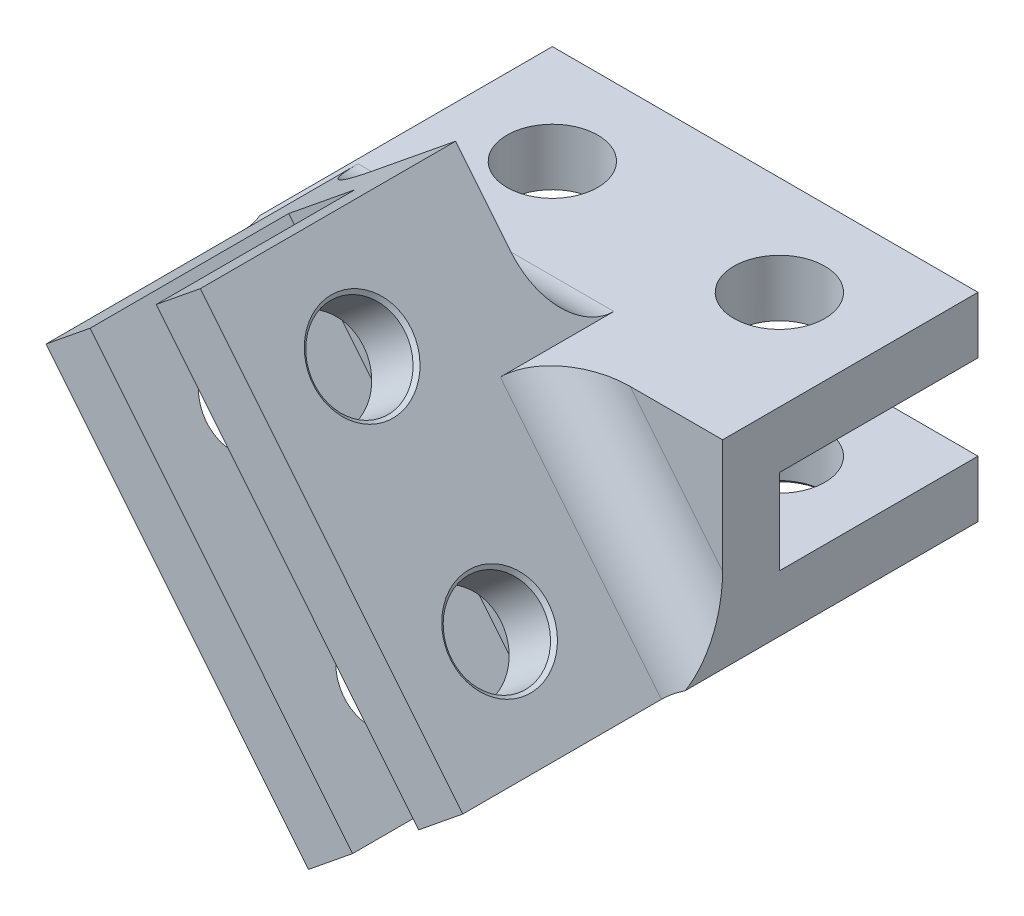
ISO-10303-21;
HEADER;
FILE_DESCRIPTION(('STEP AP214'),'2;1');
FILE_NAME('part.step','',(''),(''),'','','');
FILE_SCHEMA(('AUTOMOTIVE_DESIGN { 1 0 10303 214 1 1 1 1 }'));
ENDSEC;
DATA;
#1=APPLICATION_CONTEXT('core data for automotive mechanical design processes');
#2=APPLICATION_PROTOCOL_DEFINITION('international standard','automotive_design',2000,#1);
#3=PRODUCT_CONTEXT('',#1,'mechanical');
#4=PRODUCT('Part','Part','',(#3));
#5=PRODUCT_RELATED_PRODUCT_CATEGORY('part','',(#4));
#6=PRODUCT_DEFINITION_FORMATION('','',#4);
#7=PRODUCT_DEFINITION_CONTEXT('part definition',#1,'design');
#8=PRODUCT_DEFINITION('design','',#6,#7);
#9=PRODUCT_DEFINITION_SHAPE('','',#8);
#10=(LENGTH_UNIT() NAMED_UNIT(*) SI_UNIT(.MILLI.,.METRE.));
#11=(NAMED_UNIT(*) PLANE_ANGLE_UNIT() SI_UNIT($,.RADIAN.));
#12=(NAMED_UNIT(*) SI_UNIT($,.STERADIAN.) SOLID_ANGLE_UNIT());
#13=UNCERTAINTY_MEASURE_WITH_UNIT(LENGTH_MEASURE(1.E-05),#10,'distance_accuracy_value','');
#14=(GEOMETRIC_REPRESENTATION_CONTEXT(3) GLOBAL_UNCERTAINTY_ASSIGNED_CONTEXT((#13)) GLOBAL_UNIT_ASSIGNED_CONTEXT((#10,
#11,#12)) REPRESENTATION_CONTEXT('',''));
#15=CARTESIAN_POINT('',(0.,0.,0.));
#16=DIRECTION('',(0.,0.,1.));
#17=DIRECTION('',(1.,0.,0.));
#18=AXIS2_PLACEMENT_3D('',#15,#16,#17);
#19=CARTESIAN_POINT('',(43.5,-2.,2.));
#20=DIRECTION('',(0.,1.,0.));
#21=DIRECTION('',(-1.,0.,0.));
#22=AXIS2_PLACEMENT_3D('',#19,#20,#21);
#23=PLANE('',#22);
#24=CARTESIAN_POINT('',(47.,-2.,-3.5));
#25=DIRECTION('',(0.,-1.,0.));
#26=DIRECTION('',(0.,0.,-1.));
#27=AXIS2_PLACEMENT_3D('',#24,#25,#26);
#28=CIRCLE('',#27,1.725);
#29=CARTESIAN_POINT('',(47.,-2.,-5.225));
#30=VERTEX_POINT('',#29);
#31=EDGE_CURVE('E620',#30,#30,#28,.T.);
#32=ORIENTED_EDGE('',*,*,#31,.F.);
#33=EDGE_LOOP('',(#32));
#34=FACE_BOUND('',#33,.T.);
#35=DIRECTION('',(0.,0.,-1.));
#36=VECTOR('',#35,1.);
#37=CARTESIAN_POINT('',(58.5,-2.,2.));
#38=LINE('',#37,#36);
#39=CARTESIAN_POINT('',(58.5,-2.,3.3155102258561));
#40=VERTEX_POINT('',#39);
#41=CARTESIAN_POINT('',(58.5,-2.,-7.));
#42=VERTEX_POINT('',#41);
#43=EDGE_CURVE('E86',#40,#42,#38,.T.);
#44=ORIENTED_EDGE('',*,*,#43,.F.);
#45=CARTESIAN_POINT('',(60.9194747507506,-2.00000000000001,4.));
#46=DIRECTION('',(0.,1.,0.));
#47=DIRECTION('',(-1.,0.,0.));
#48=AXIS2_PLACEMENT_3D('',#45,#46,#47);
#49=ELLIPSE('',#48,2.57497548526868,2.);
#50=CARTESIAN_POINT('',(58.3444992654819,-2.,4.));
#51=VERTEX_POINT('',#50);
#52=EDGE_CURVE('E12',#40,#51,#49,.T.);
#53=ORIENTED_EDGE('',*,*,#52,.T.);
#54=DIRECTION('',(0.,0.,-1.));
#55=VECTOR('',#54,1.);
#56=CARTESIAN_POINT('',(58.3444992654819,-2.,2.));
#57=LINE('',#56,#55);
#58=CARTESIAN_POINT('',(58.3444992654819,-2.,0.));
#59=VERTEX_POINT('',#58);
#60=EDGE_CURVE('E78',#51,#59,#57,.T.);
#61=ORIENTED_EDGE('',*,*,#60,.T.);
#62=DIRECTION('',(1.,0.,0.));
#63=VECTOR('',#62,1.);
#64=CARTESIAN_POINT('',(49.3320850670415,-2.,0.));
#65=LINE('',#64,#63);
#66=CARTESIAN_POINT('',(49.3320850670415,-2.,0.));
#67=VERTEX_POINT('',#66);
#68=EDGE_CURVE('E373',#59,#67,#65,.F.);
#69=ORIENTED_EDGE('',*,*,#68,.T.);
#70=DIRECTION('',(0.,0.,1.));
#71=VECTOR('',#70,1.);
#72=CARTESIAN_POINT('',(49.3320850670415,-2.,2.));
#73=LINE('',#72,#71);
#74=CARTESIAN_POINT('',(49.3320850670415,-2.,4.));
#75=VERTEX_POINT('',#74);
#76=EDGE_CURVE('E371',#67,#75,#73,.T.);
#77=ORIENTED_EDGE('',*,*,#76,.T.);
#78=CARTESIAN_POINT('',(46.7571095817728,-2.,4.));
#79=DIRECTION('',(0.,1.,0.));
#80=DIRECTION('',(1.,0.,0.));
#81=AXIS2_PLACEMENT_3D('',#78,#79,#80);
#82=ELLIPSE('',#81,2.57497548526868,2.);
#83=CARTESIAN_POINT('',(46.7571095817728,-2.,2.));
#84=VERTEX_POINT('',#83);
#85=EDGE_CURVE('E413',#75,#84,#82,.T.);
#86=ORIENTED_EDGE('',*,*,#85,.T.);
#87=DIRECTION('',(1.,0.,0.));
#88=VECTOR('',#87,1.);
#89=CARTESIAN_POINT('',(43.5,-2.,2.));
#90=LINE('',#89,#88);
#91=CARTESIAN_POINT('',(43.5,-2.,2.));
#92=VERTEX_POINT('',#91);
#93=EDGE_CURVE('E308',#92,#84,#90,.T.);
#94=ORIENTED_EDGE('',*,*,#93,.F.);
#95=DIRECTION('',(0.,0.,-1.));
#96=VECTOR('',#95,1.);
#97=CARTESIAN_POINT('',(43.5,-2.,2.));
#98=LINE('',#97,#96);
#99=CARTESIAN_POINT('',(43.5,-2.,-7.));
#100=VERTEX_POINT('',#99);
#101=EDGE_CURVE('E321',#92,#100,#98,.T.);
#102=ORIENTED_EDGE('',*,*,#101,.T.);
#103=DIRECTION('',(1.,0.,0.));
#104=VECTOR('',#103,1.);
#105=CARTESIAN_POINT('',(58.5,-2.,-7.));
#106=LINE('',#105,#104);
#107=EDGE_CURVE('E288',#100,#42,#106,.T.);
#108=ORIENTED_EDGE('',*,*,#107,.T.);
#109=EDGE_LOOP('',(#44,#53,#61,#69,#77,#86,#94,#102,#108));
#110=FACE_BOUND('',#109,.T.);
#111=CARTESIAN_POINT('',(55.,-2.,-3.5));
#112=DIRECTION('',(0.,-1.,0.));
#113=DIRECTION('',(0.,0.,-1.));
#114=AXIS2_PLACEMENT_3D('',#111,#112,#113);
#115=CIRCLE('',#114,1.725);
#116=CARTESIAN_POINT('',(55.,-2.,-5.225));
#117=VERTEX_POINT('',#116);
#118=EDGE_CURVE('E611',#117,#117,#115,.T.);
#119=ORIENTED_EDGE('',*,*,#118,.F.);
#120=EDGE_LOOP('',(#119));
#121=FACE_BOUND('',#120,.T.);
#122=ADVANCED_FACE('F63',(#34,#110,#121),#23,.F.);
#123=CARTESIAN_POINT('',(0.,0.,2.));
#124=DIRECTION('',(0.,0.,1.));
#125=DIRECTION('',(1.,0.,0.));
#126=AXIS2_PLACEMENT_3D('',#123,#124,#125);
#127=PLANE('',#126);
#128=DIRECTION('',(-1.,0.,0.));
#129=VECTOR('',#128,1.);
#130=CARTESIAN_POINT('',(58.5,5.,2.));
#131=LINE('',#130,#129);
#132=CARTESIAN_POINT('',(58.5,5.,2.));
#133=VERTEX_POINT('',#132);
#134=CARTESIAN_POINT('',(55.2428904182272,5.,2.));
#135=VERTEX_POINT('',#134);
#136=EDGE_CURVE('E314',#133,#135,#131,.T.);
#137=ORIENTED_EDGE('',*,*,#136,.T.);
#138=DIRECTION('',(-0.629862787876053,0.776706423591956,0.));
#139=VECTOR('',#138,1.);
#140=CARTESIAN_POINT('',(35.7726293306424,29.009478170213,2.));
#141=LINE('',#140,#139);
#142=CARTESIAN_POINT('',(58.5,0.983541204209584,2.));
#143=VERTEX_POINT('',#142);
#144=EDGE_CURVE('E405',#135,#143,#141,.F.);
#145=ORIENTED_EDGE('',*,*,#144,.T.);
#146=DIRECTION('',(0.,1.,0.));
#147=VECTOR('',#146,1.);
#148=CARTESIAN_POINT('',(58.5,-2.,2.));
#149=LINE('',#148,#147);
#150=EDGE_CURVE('E312',#143,#133,#149,.T.);
#151=ORIENTED_EDGE('',*,*,#150,.T.);
#152=EDGE_LOOP('',(#137,#145,#151));
#153=FACE_BOUND('',#152,.T.);
#154=ADVANCED_FACE('F484',(#153),#127,.T.);
#155=ORIENTED_EDGE('',*,*,#93,.T.);
#156=DIRECTION('',(-0.629862787876052,0.776706423591956,0.));
#157=VECTOR('',#156,1.);
#158=CARTESIAN_POINT('',(42.1020878873342,3.74027442424788,2.));
#159=LINE('',#158,#157);
#160=CARTESIAN_POINT('',(43.5,2.01645879579042,2.));
#161=VERTEX_POINT('',#160);
#162=EDGE_CURVE('E396',#84,#161,#159,.T.);
#163=ORIENTED_EDGE('',*,*,#162,.T.);
#164=DIRECTION('',(0.,-1.,0.));
#165=VECTOR('',#164,1.);
#166=CARTESIAN_POINT('',(43.5,-2.,2.));
#167=LINE('',#166,#165);
#168=EDGE_CURVE('E306',#161,#92,#167,.T.);
#169=ORIENTED_EDGE('',*,*,#168,.T.);
#170=EDGE_LOOP('',(#155,#163,#169));
#171=FACE_BOUND('',#170,.T.);
#172=ADVANCED_FACE('F457',(#171),#127,.T.);
#173=CARTESIAN_POINT('',(43.5,5.,-7.));
#174=DIRECTION('',(-1.,0.,0.));
#175=DIRECTION('',(0.,0.,1.));
#176=AXIS2_PLACEMENT_3D('',#173,#174,#175);
#177=PLANE('',#176);
#178=DIRECTION('',(0.,0.,1.));
#179=VECTOR('',#178,1.);
#180=CARTESIAN_POINT('',(43.5,2.99999999999999,-7.));
#181=LINE('',#180,#179);
#182=CARTESIAN_POINT('',(43.5,2.99999999999999,-7.));
#183=VERTEX_POINT('',#182);
#184=CARTESIAN_POINT('',(43.5,2.99999999999999,0.));
#185=VERTEX_POINT('',#184);
#186=EDGE_CURVE('E336',#183,#185,#181,.T.);
#187=ORIENTED_EDGE('',*,*,#186,.T.);
#188=DIRECTION('',(0.,-1.,0.));
#189=VECTOR('',#188,1.);
#190=CARTESIAN_POINT('',(43.5,-2.,0.));
#191=LINE('',#190,#189);
#192=CARTESIAN_POINT('',(43.5,0.,0.));
#193=VERTEX_POINT('',#192);
#194=EDGE_CURVE('E304',#185,#193,#191,.T.);
#195=ORIENTED_EDGE('',*,*,#194,.T.);
#196=DIRECTION('',(0.,0.,1.));
#197=VECTOR('',#196,1.);
#198=CARTESIAN_POINT('',(43.5,0.,-7.));
#199=LINE('',#198,#197);
#200=CARTESIAN_POINT('',(43.5,0.,-7.));
#201=VERTEX_POINT('',#200);
#202=EDGE_CURVE('E302',#201,#193,#199,.T.);
#203=ORIENTED_EDGE('',*,*,#202,.F.);
#204=DIRECTION('',(0.,-1.,0.));
#205=VECTOR('',#204,1.);
#206=CARTESIAN_POINT('',(43.5,-2.,-7.));
#207=LINE('',#206,#205);
#208=EDGE_CURVE('E296',#201,#100,#207,.T.);
#209=ORIENTED_EDGE('',*,*,#208,.T.);
#210=ORIENTED_EDGE('',*,*,#101,.F.);
#211=ORIENTED_EDGE('',*,*,#168,.F.);
#212=CARTESIAN_POINT('',(43.5,2.01645879579043,4.));
#213=DIRECTION('',(-1.,0.,0.));
#214=DIRECTION('',(0.,-1.,0.));
#215=AXIS2_PLACEMENT_3D('',#212,#213,#214);
#216=ELLIPSE('',#215,3.17529474434291,2.);
#217=CARTESIAN_POINT('',(43.5,5.,3.31551022585607));
#218=VERTEX_POINT('',#217);
#219=EDGE_CURVE('E407',#161,#218,#216,.F.);
#220=ORIENTED_EDGE('',*,*,#219,.T.);
#221=DIRECTION('',(0.,0.,1.));
#222=VECTOR('',#221,1.);
#223=CARTESIAN_POINT('',(43.5,5.,-7.));
#224=LINE('',#223,#222);
#225=CARTESIAN_POINT('',(43.5,5.,-7.));
#226=VERTEX_POINT('',#225);
#227=EDGE_CURVE('E339',#226,#218,#224,.T.);
#228=ORIENTED_EDGE('',*,*,#227,.F.);
#229=DIRECTION('',(0.,-1.,0.));
#230=VECTOR('',#229,1.);
#231=CARTESIAN_POINT('',(43.5,5.,-7.));
#232=LINE('',#231,#230);
#233=EDGE_CURVE('E324',#226,#183,#232,.T.);
#234=ORIENTED_EDGE('',*,*,#233,.T.);
#235=EDGE_LOOP('',(#187,#195,#203,#209,#210,#211,#220,#228,#234));
#236=FACE_BOUND('',#235,.T.);
#237=ADVANCED_FACE('F460',(#236),#177,.T.);
#238=CARTESIAN_POINT('',(58.5,5.,-7.));
#239=DIRECTION('',(0.,1.,0.));
#240=DIRECTION('',(0.,0.,1.));
#241=AXIS2_PLACEMENT_3D('',#238,#239,#240);
#242=PLANE('',#241);
#243=CARTESIAN_POINT('',(55.,5.,-3.5));
#244=DIRECTION('',(0.,1.,0.));
#245=DIRECTION('',(0.,0.,1.));
#246=AXIS2_PLACEMENT_3D('',#243,#244,#245);
#247=CIRCLE('',#246,1.59999999999999);
#248=CARTESIAN_POINT('',(55.,5.,-1.9));
#249=VERTEX_POINT('',#248);
#250=EDGE_CURVE('E364',#249,#249,#247,.T.);
#251=ORIENTED_EDGE('',*,*,#250,.F.);
#252=EDGE_LOOP('',(#251));
#253=FACE_BOUND('',#252,.T.);
#254=CARTESIAN_POINT('',(47.,5.,-3.5));
#255=DIRECTION('',(0.,1.,0.));
#256=DIRECTION('',(0.,0.,1.));
#257=AXIS2_PLACEMENT_3D('',#254,#255,#256);
#258=CIRCLE('',#257,1.59999999999999);
#259=CARTESIAN_POINT('',(47.,5.,-1.9));
#260=VERTEX_POINT('',#259);
#261=EDGE_CURVE('E627',#260,#260,#258,.T.);
#262=ORIENTED_EDGE('',*,*,#261,.F.);
#263=EDGE_LOOP('',(#262));
#264=FACE_BOUND('',#263,.T.);
#265=ORIENTED_EDGE('',*,*,#227,.T.);
#266=CARTESIAN_POINT('',(41.0805252492494,4.99999999999999,4.));
#267=DIRECTION('',(0.,1.,0.));
#268=DIRECTION('',(1.,0.,0.));
#269=AXIS2_PLACEMENT_3D('',#266,#267,#268);
#270=ELLIPSE('',#269,2.57497548526868,2.);
#271=CARTESIAN_POINT('',(43.6555007345181,5.,4.));
#272=VERTEX_POINT('',#271);
#273=EDGE_CURVE('E410',#218,#272,#270,.F.);
#274=ORIENTED_EDGE('',*,*,#273,.T.);
#275=DIRECTION('',(0.,0.,-1.));
#276=VECTOR('',#275,1.);
#277=CARTESIAN_POINT('',(43.6555007345181,5.,11.));
#278=LINE('',#277,#276);
#279=CARTESIAN_POINT('',(43.6555007345181,5.,0.));
#280=VERTEX_POINT('',#279);
#281=EDGE_CURVE('E385',#272,#280,#278,.T.);
#282=ORIENTED_EDGE('',*,*,#281,.T.);
#283=DIRECTION('',(-1.,0.,0.));
#284=VECTOR('',#283,1.);
#285=CARTESIAN_POINT('',(58.5,5.,0.));
#286=LINE('',#285,#284);
#287=CARTESIAN_POINT('',(52.6679149329585,5.,0.));
#288=VERTEX_POINT('',#287);
#289=EDGE_CURVE('E382',#280,#288,#286,.F.);
#290=ORIENTED_EDGE('',*,*,#289,.T.);
#291=DIRECTION('',(0.,0.,1.));
#292=VECTOR('',#291,1.);
#293=CARTESIAN_POINT('',(52.6679149329585,5.,-7.));
#294=LINE('',#293,#292);
#295=CARTESIAN_POINT('',(52.6679149329585,5.,4.));
#296=VERTEX_POINT('',#295);
#297=EDGE_CURVE('E380',#288,#296,#294,.T.);
#298=ORIENTED_EDGE('',*,*,#297,.T.);
#299=CARTESIAN_POINT('',(55.2428904182272,5.,4.));
#300=DIRECTION('',(0.,1.,0.));
#301=DIRECTION('',(-1.,0.,0.));
#302=AXIS2_PLACEMENT_3D('',#299,#300,#301);
#303=ELLIPSE('',#302,2.57497548526868,2.);
#304=EDGE_CURVE('E415',#296,#135,#303,.F.);
#305=ORIENTED_EDGE('',*,*,#304,.T.);
#306=ORIENTED_EDGE('',*,*,#136,.F.);
#307=DIRECTION('',(0.,0.,1.));
#308=VECTOR('',#307,1.);
#309=CARTESIAN_POINT('',(58.5,5.,-7.));
#310=LINE('',#309,#308);
#311=CARTESIAN_POINT('',(58.5,5.,-7.));
#312=VERTEX_POINT('',#311);
#313=EDGE_CURVE('E342',#312,#133,#310,.T.);
#314=ORIENTED_EDGE('',*,*,#313,.F.);
#315=DIRECTION('',(-1.,0.,0.));
#316=VECTOR('',#315,1.);
#317=CARTESIAN_POINT('',(58.5,5.,-7.));
#318=LINE('',#317,#316);
#319=EDGE_CURVE('E333',#312,#226,#318,.T.);
#320=ORIENTED_EDGE('',*,*,#319,.T.);
#321=EDGE_LOOP('',(#265,#274,#282,#290,#298,#305,#306,#314,#320));
#322=FACE_BOUND('',#321,.T.);
#323=ADVANCED_FACE('F449',(#253,#264,#322),#242,.T.);
#324=CARTESIAN_POINT('',(58.5,3.,-7.));
#325=DIRECTION('',(1.,0.,0.));
#326=DIRECTION('',(0.,0.,-1.));
#327=AXIS2_PLACEMENT_3D('',#324,#325,#326);
#328=PLANE('',#327);
#329=ORIENTED_EDGE('',*,*,#313,.T.);
#330=ORIENTED_EDGE('',*,*,#150,.F.);
#331=CARTESIAN_POINT('',(58.5,0.983541204209581,4.));
#332=DIRECTION('',(1.,0.,0.));
#333=DIRECTION('',(0.,1.,0.));
#334=AXIS2_PLACEMENT_3D('',#331,#332,#333);
#335=ELLIPSE('',#334,3.1752947443429,2.);
#336=EDGE_CURVE('E71',#143,#40,#335,.F.);
#337=ORIENTED_EDGE('',*,*,#336,.T.);
#338=ORIENTED_EDGE('',*,*,#43,.T.);
#339=DIRECTION('',(0.,1.,0.));
#340=VECTOR('',#339,1.);
#341=CARTESIAN_POINT('',(58.5,0.,-7.));
#342=LINE('',#341,#340);
#343=CARTESIAN_POINT('',(58.5,0.,-7.));
#344=VERTEX_POINT('',#343);
#345=EDGE_CURVE('E290',#42,#344,#342,.T.);
#346=ORIENTED_EDGE('',*,*,#345,.T.);
#347=DIRECTION('',(0.,0.,1.));
#348=VECTOR('',#347,1.);
#349=CARTESIAN_POINT('',(58.5,0.,-7.));
#350=LINE('',#349,#348);
#351=CARTESIAN_POINT('',(58.5,0.,0.));
#352=VERTEX_POINT('',#351);
#353=EDGE_CURVE('E299',#344,#352,#350,.T.);
#354=ORIENTED_EDGE('',*,*,#353,.T.);
#355=DIRECTION('',(0.,1.,0.));
#356=VECTOR('',#355,1.);
#357=CARTESIAN_POINT('',(58.5,-2.,0.));
#358=LINE('',#357,#356);
#359=CARTESIAN_POINT('',(58.5,2.99999999999999,0.));
#360=VERTEX_POINT('',#359);
#361=EDGE_CURVE('E309',#352,#360,#358,.T.);
#362=ORIENTED_EDGE('',*,*,#361,.T.);
#363=DIRECTION('',(0.,0.,1.));
#364=VECTOR('',#363,1.);
#365=CARTESIAN_POINT('',(58.5,3.,-7.));
#366=LINE('',#365,#364);
#367=CARTESIAN_POINT('',(58.5,3.,-7.));
#368=VERTEX_POINT('',#367);
#369=EDGE_CURVE('E345',#368,#360,#366,.T.);
#370=ORIENTED_EDGE('',*,*,#369,.F.);
#371=DIRECTION('',(0.,1.,0.));
#372=VECTOR('',#371,1.);
#373=CARTESIAN_POINT('',(58.5,3.,-7.));
#374=LINE('',#373,#372);
#375=EDGE_CURVE('E330',#368,#312,#374,.T.);
#376=ORIENTED_EDGE('',*,*,#375,.T.);
#377=EDGE_LOOP('',(#329,#330,#337,#338,#346,#354,#362,#370,#376));
#378=FACE_BOUND('',#377,.T.);
#379=ADVANCED_FACE('F420',(#378),#328,.T.);
#380=CARTESIAN_POINT('',(58.5,3.,-7.));
#381=DIRECTION('',(0.,-1.,0.));
#382=DIRECTION('',(1.,0.,0.));
#383=AXIS2_PLACEMENT_3D('',#380,#381,#382);
#384=PLANE('',#383);
#385=CARTESIAN_POINT('',(55.,2.99999999999999,-3.5));
#386=DIRECTION('',(0.,-1.,0.));
#387=DIRECTION('',(1.,0.,0.));
#388=AXIS2_PLACEMENT_3D('',#385,#386,#387);
#389=CIRCLE('',#388,1.59999999999999);
#390=CARTESIAN_POINT('',(56.6,2.99999999999999,-3.5));
#391=VERTEX_POINT('',#390);
#392=EDGE_CURVE('E617',#391,#391,#389,.T.);
#393=ORIENTED_EDGE('',*,*,#392,.F.);
#394=EDGE_LOOP('',(#393));
#395=FACE_BOUND('',#394,.T.);
#396=CARTESIAN_POINT('',(47.,2.99999999999999,-3.5));
#397=DIRECTION('',(0.,-1.,0.));
#398=DIRECTION('',(1.,0.,0.));
#399=AXIS2_PLACEMENT_3D('',#396,#397,#398);
#400=CIRCLE('',#399,1.59999999999999);
#401=CARTESIAN_POINT('',(48.6,2.99999999999999,-3.5));
#402=VERTEX_POINT('',#401);
#403=EDGE_CURVE('E359',#402,#402,#400,.T.);
#404=ORIENTED_EDGE('',*,*,#403,.F.);
#405=EDGE_LOOP('',(#404));
#406=FACE_BOUND('',#405,.T.);
#407=DIRECTION('',(1.,0.,0.));
#408=VECTOR('',#407,1.);
#409=CARTESIAN_POINT('',(58.5,3.,0.));
#410=LINE('',#409,#408);
#411=EDGE_CURVE('E323',#185,#360,#410,.T.);
#412=ORIENTED_EDGE('',*,*,#411,.F.);
#413=ORIENTED_EDGE('',*,*,#186,.F.);
#414=DIRECTION('',(1.,0.,0.));
#415=VECTOR('',#414,1.);
#416=CARTESIAN_POINT('',(58.5,3.,-7.));
#417=LINE('',#416,#415);
#418=EDGE_CURVE('E327',#183,#368,#417,.T.);
#419=ORIENTED_EDGE('',*,*,#418,.T.);
#420=ORIENTED_EDGE('',*,*,#369,.T.);
#421=EDGE_LOOP('',(#412,#413,#419,#420));
#422=FACE_BOUND('',#421,.T.);
#423=ADVANCED_FACE('F475',(#395,#406,#422),#384,.T.);
#424=CARTESIAN_POINT('',(0.,0.,-7.));
#425=DIRECTION('',(0.,0.,-1.));
#426=DIRECTION('',(-1.,0.,0.));
#427=AXIS2_PLACEMENT_3D('',#424,#425,#426);
#428=PLANE('',#427);
#429=ORIENTED_EDGE('',*,*,#233,.F.);
#430=ORIENTED_EDGE('',*,*,#319,.F.);
#431=ORIENTED_EDGE('',*,*,#375,.F.);
#432=ORIENTED_EDGE('',*,*,#418,.F.);
#433=EDGE_LOOP('',(#429,#430,#431,#432));
#434=FACE_BOUND('',#433,.T.);
#435=ADVANCED_FACE('F481',(#434),#428,.T.);
#436=CARTESIAN_POINT('',(0.,0.,0.));
#437=DIRECTION('',(0.,0.,1.));
#438=DIRECTION('',(1.,0.,0.));
#439=AXIS2_PLACEMENT_3D('',#436,#437,#438);
#440=PLANE('',#439);
#441=ORIENTED_EDGE('',*,*,#361,.F.);
#442=DIRECTION('',(-1.,0.,0.));
#443=VECTOR('',#442,1.);
#444=CARTESIAN_POINT('',(58.5,0.,0.));
#445=LINE('',#444,#443);
#446=EDGE_CURVE('E287',#352,#193,#445,.T.);
#447=ORIENTED_EDGE('',*,*,#446,.T.);
#448=ORIENTED_EDGE('',*,*,#194,.F.);
#449=ORIENTED_EDGE('',*,*,#411,.T.);
#450=EDGE_LOOP('',(#441,#447,#448,#449));
#451=FACE_BOUND('',#450,.T.);
#452=ADVANCED_FACE('F472',(#451),#440,.F.);
#453=CARTESIAN_POINT('',(58.5,0.,-7.));
#454=DIRECTION('',(0.,1.,0.));
#455=DIRECTION('',(-1.,0.,0.));
#456=AXIS2_PLACEMENT_3D('',#453,#454,#455);
#457=PLANE('',#456);
#458=CARTESIAN_POINT('',(55.,0.,-3.5));
#459=DIRECTION('',(0.,1.,0.));
#460=DIRECTION('',(-1.,0.,0.));
#461=AXIS2_PLACEMENT_3D('',#458,#459,#460);
#462=CIRCLE('',#461,1.59999999999999);
#463=CARTESIAN_POINT('',(53.4,0.,-3.5));
#464=VERTEX_POINT('',#463);
#465=EDGE_CURVE('E367',#464,#464,#462,.T.);
#466=ORIENTED_EDGE('',*,*,#465,.F.);
#467=EDGE_LOOP('',(#466));
#468=FACE_BOUND('',#467,.T.);
#469=CARTESIAN_POINT('',(47.,0.,-3.5));
#470=DIRECTION('',(0.,1.,0.));
#471=DIRECTION('',(-1.,0.,0.));
#472=AXIS2_PLACEMENT_3D('',#469,#470,#471);
#473=CIRCLE('',#472,1.59999999999999);
#474=CARTESIAN_POINT('',(45.4,0.,-3.5));
#475=VERTEX_POINT('',#474);
#476=EDGE_CURVE('E362',#475,#475,#473,.T.);
#477=ORIENTED_EDGE('',*,*,#476,.F.);
#478=EDGE_LOOP('',(#477));
#479=FACE_BOUND('',#478,.T.);
#480=ORIENTED_EDGE('',*,*,#446,.F.);
#481=ORIENTED_EDGE('',*,*,#353,.F.);
#482=DIRECTION('',(-1.,0.,0.));
#483=VECTOR('',#482,1.);
#484=CARTESIAN_POINT('',(58.5,0.,-7.));
#485=LINE('',#484,#483);
#486=EDGE_CURVE('E293',#344,#201,#485,.T.);
#487=ORIENTED_EDGE('',*,*,#486,.T.);
#488=ORIENTED_EDGE('',*,*,#202,.T.);
#489=EDGE_LOOP('',(#480,#481,#487,#488));
#490=FACE_BOUND('',#489,.T.);
#491=ADVANCED_FACE('F469',(#468,#479,#490),#457,.T.);
#492=CARTESIAN_POINT('',(0.,0.,-7.));
#493=DIRECTION('',(0.,0.,-1.));
#494=DIRECTION('',(-1.,0.,0.));
#495=AXIS2_PLACEMENT_3D('',#492,#493,#494);
#496=PLANE('',#495);
#497=ORIENTED_EDGE('',*,*,#107,.F.);
#498=ORIENTED_EDGE('',*,*,#208,.F.);
#499=ORIENTED_EDGE('',*,*,#486,.F.);
#500=ORIENTED_EDGE('',*,*,#345,.F.);
#501=EDGE_LOOP('',(#497,#498,#499,#500));
#502=FACE_BOUND('',#501,.T.);
#503=ADVANCED_FACE('F464',(#502),#496,.T.);
#504=CARTESIAN_POINT('',(0.,0.,2.));
#505=DIRECTION('',(0.,0.,1.));
#506=DIRECTION('',(1.,0.,0.));
#507=AXIS2_PLACEMENT_3D('',#504,#505,#506);
#508=PLANE('',#507);
#509=DIRECTION('',(-0.629862787876052,0.776706423591956,0.));
#510=VECTOR('',#509,1.);
#511=CARTESIAN_POINT('',(28.7822715183148,23.3407130793285,2.));
#512=LINE('',#511,#510);
#513=CARTESIAN_POINT('',(52.9075543003382,-6.40903951513235,2.));
#514=VERTEX_POINT('',#513);
#515=CARTESIAN_POINT('',(50.9539663049053,-4.00000000000001,2.));
#516=VERTEX_POINT('',#515);
#517=EDGE_CURVE('E259',#514,#516,#512,.T.);
#518=ORIENTED_EDGE('',*,*,#517,.T.);
#519=DIRECTION('',(1.,0.,0.));
#520=VECTOR('',#519,1.);
#521=CARTESIAN_POINT('',(58.3444992654819,-4.,2.));
#522=LINE('',#521,#520);
#523=CARTESIAN_POINT('',(55.878227440753,-4.00000000000001,2.));
#524=VERTEX_POINT('',#523);
#525=EDGE_CURVE('E341',#516,#524,#522,.T.);
#526=ORIENTED_EDGE('',*,*,#525,.T.);
#527=DIRECTION('',(-0.776706423591959,-0.629862787876048,0.));
#528=VECTOR('',#527,1.);
#529=CARTESIAN_POINT('',(24.1252827820231,-29.7497525944609,2.));
#530=LINE('',#529,#528);
#531=EDGE_CURVE('E274',#524,#514,#530,.T.);
#532=ORIENTED_EDGE('',*,*,#531,.T.);
#533=EDGE_LOOP('',(#518,#526,#532));
#534=FACE_BOUND('',#533,.T.);
#535=ADVANCED_FACE('F436',(#534),#508,.F.);
#536=DIRECTION('',(-0.629862787876053,0.776706423591956,0.));
#537=VECTOR('',#536,1.);
#538=CARTESIAN_POINT('',(34.2192164834585,27.7497525944609,2.));
#539=LINE('',#538,#537);
#540=CARTESIAN_POINT('',(51.0460336950947,7.,2.));
#541=VERTEX_POINT('',#540);
#542=CARTESIAN_POINT('',(49.0924456996618,9.40903951513235,2.));
#543=VERTEX_POINT('',#542);
#544=EDGE_CURVE('E254',#541,#543,#539,.T.);
#545=ORIENTED_EDGE('',*,*,#544,.F.);
#546=DIRECTION('',(-1.,0.,0.));
#547=VECTOR('',#546,1.);
#548=CARTESIAN_POINT('',(0.,7.,2.));
#549=LINE('',#548,#547);
#550=CARTESIAN_POINT('',(46.121772559247,7.,2.));
#551=VERTEX_POINT('',#550);
#552=EDGE_CURVE('E377',#541,#551,#549,.T.);
#553=ORIENTED_EDGE('',*,*,#552,.T.);
#554=DIRECTION('',(0.776706423591958,0.62986278787605,0.));
#555=VECTOR('',#554,1.);
#556=CARTESIAN_POINT('',(14.8732292162032,-18.3407130793285,2.));
#557=LINE('',#556,#555);
#558=EDGE_CURVE('E264',#551,#543,#557,.T.);
#559=ORIENTED_EDGE('',*,*,#558,.T.);
#560=EDGE_LOOP('',(#545,#553,#559));
#561=FACE_BOUND('',#560,.T.);
#562=ADVANCED_FACE('F500',(#561),#508,.F.);
#563=CARTESIAN_POINT('',(28.7822715183148,23.3407130793285,11.));
#564=DIRECTION('',(-0.776706423591956,-0.629862787876052,0.));
#565=DIRECTION('',(0.629862787876052,-0.776706423591956,0.));
#566=AXIS2_PLACEMENT_3D('',#563,#564,#565);
#567=PLANE('',#566);
#568=CARTESIAN_POINT('',(45.8600204920843,2.28152751742814,7.5));
#569=DIRECTION('',(-0.776706423591956,-0.629862787876052,0.));
#570=DIRECTION('',(0.629862787876052,-0.776706423591956,0.));
#571=AXIS2_PLACEMENT_3D('',#568,#569,#570);
#572=CIRCLE('',#571,1.6);
#573=CARTESIAN_POINT('',(46.867800952686,1.03879723968101,7.5));
#574=VERTEX_POINT('',#573);
#575=EDGE_CURVE('E357',#574,#574,#572,.T.);
#576=ORIENTED_EDGE('',*,*,#575,.F.);
#577=EDGE_LOOP('',(#576));
#578=FACE_BOUND('',#577,.T.);
#579=CARTESIAN_POINT('',(50.703034542772,-3.69056703256054,7.5));
#580=DIRECTION('',(-0.776706423591956,-0.629862787876052,0.));
#581=DIRECTION('',(0.629862787876052,-0.776706423591956,0.));
#582=AXIS2_PLACEMENT_3D('',#579,#580,#581);
#583=CIRCLE('',#582,1.6);
#584=CARTESIAN_POINT('',(51.7108150033737,-4.93329731030767,7.5));
#585=VERTEX_POINT('',#584);
#586=EDGE_CURVE('E240',#585,#585,#583,.T.);
#587=ORIENTED_EDGE('',*,*,#586,.F.);
#588=EDGE_LOOP('',(#587));
#589=FACE_BOUND('',#588,.T.);
#590=DIRECTION('',(0.,0.,-1.));
#591=VECTOR('',#590,1.);
#592=CARTESIAN_POINT('',(43.6555007345181,5.,11.));
#593=LINE('',#592,#591);
#594=CARTESIAN_POINT('',(43.6555007345181,5.,11.));
#595=VERTEX_POINT('',#594);
#596=EDGE_CURVE('E271',#595,#272,#593,.T.);
#597=ORIENTED_EDGE('',*,*,#596,.T.);
#598=DIRECTION('',(-0.629862787876052,0.776706423591956,0.));
#599=VECTOR('',#598,1.);
#600=CARTESIAN_POINT('',(49.3320850670415,-2.00000000000002,4.));
#601=LINE('',#600,#599);
#602=EDGE_CURVE('E399',#272,#75,#601,.F.);
#603=ORIENTED_EDGE('',*,*,#602,.T.);
#604=ORIENTED_EDGE('',*,*,#76,.F.);
#605=CARTESIAN_POINT('',(50.9539663049053,-4.,0.));
#606=DIRECTION('',(-0.776706423591956,-0.629862787876052,0.));
#607=DIRECTION('',(-0.629862787876052,0.776706423591956,0.));
#608=AXIS2_PLACEMENT_3D('',#605,#606,#607);
#609=ELLIPSE('',#608,2.57497548526868,2.);
#610=EDGE_CURVE('E390',#67,#516,#609,.F.);
#611=ORIENTED_EDGE('',*,*,#610,.T.);
#612=ORIENTED_EDGE('',*,*,#517,.F.);
#613=DIRECTION('',(0.,0.,-1.));
#614=VECTOR('',#613,1.);
#615=CARTESIAN_POINT('',(52.9075543003382,-6.40903951513235,11.));
#616=LINE('',#615,#614);
#617=CARTESIAN_POINT('',(52.9075543003382,-6.40903951513235,11.));
#618=VERTEX_POINT('',#617);
#619=EDGE_CURVE('E284',#618,#514,#616,.T.);
#620=ORIENTED_EDGE('',*,*,#619,.F.);
#621=DIRECTION('',(-0.629862787876052,0.776706423591956,0.));
#622=VECTOR('',#621,1.);
#623=CARTESIAN_POINT('',(28.7822715183148,23.3407130793285,11.));
#624=LINE('',#623,#622);
#625=EDGE_CURVE('E260',#618,#595,#624,.T.);
#626=ORIENTED_EDGE('',*,*,#625,.T.);
#627=EDGE_LOOP('',(#597,#603,#604,#611,#612,#620,#626));
#628=FACE_BOUND('',#627,.T.);
#629=ADVANCED_FACE('F434',(#578,#589,#628),#567,.T.);
#630=CARTESIAN_POINT('',(24.1252827820231,-29.7497525944609,11.));
#631=DIRECTION('',(0.629862787876048,-0.776706423591959,0.));
#632=DIRECTION('',(0.776706423591959,0.629862787876048,0.));
#633=AXIS2_PLACEMENT_3D('',#630,#631,#632);
#634=PLANE('',#633);
#635=ORIENTED_EDGE('',*,*,#619,.T.);
#636=ORIENTED_EDGE('',*,*,#531,.F.);
#637=CARTESIAN_POINT('',(55.878227440753,-4.,0.));
#638=DIRECTION('',(0.629862787876048,-0.776706423591959,0.));
#639=DIRECTION('',(-0.776706423591959,-0.629862787876048,0.));
#640=AXIS2_PLACEMENT_3D('',#637,#638,#639);
#641=ELLIPSE('',#640,3.17529474434293,2.);
#642=EDGE_CURVE('E388',#524,#59,#641,.F.);
#643=ORIENTED_EDGE('',*,*,#642,.T.);
#644=ORIENTED_EDGE('',*,*,#60,.F.);
#645=DIRECTION('',(0.,0.,-1.));
#646=VECTOR('',#645,1.);
#647=CARTESIAN_POINT('',(58.3444992654819,-2.,11.));
#648=LINE('',#647,#646);
#649=CARTESIAN_POINT('',(58.3444992654819,-2.,11.));
#650=VERTEX_POINT('',#649);
#651=EDGE_CURVE('E249',#650,#51,#648,.T.);
#652=ORIENTED_EDGE('',*,*,#651,.F.);
#653=DIRECTION('',(0.776706423591958,0.62986278787605,0.));
#654=VECTOR('',#653,1.);
#655=CARTESIAN_POINT('',(24.1252827820232,-29.7497525944609,11.));
#656=LINE('',#655,#654);
#657=CARTESIAN_POINT('',(56.791086418298,-3.25972557575209,11.));
#658=VERTEX_POINT('',#657);
#659=EDGE_CURVE('E490',#658,#650,#656,.T.);
#660=ORIENTED_EDGE('',*,*,#659,.F.);
#661=DIRECTION('',(0.,0.,-1.));
#662=VECTOR('',#661,1.);
#663=CARTESIAN_POINT('',(56.791086418298,-3.25972557575209,11.));
#664=LINE('',#663,#662);
#665=CARTESIAN_POINT('',(56.791086418298,-3.2597255757521,4.));
#666=VERTEX_POINT('',#665);
#667=EDGE_CURVE('E257',#658,#666,#664,.T.);
#668=ORIENTED_EDGE('',*,*,#667,.T.);
#669=DIRECTION('',(0.776706423591958,0.62986278787605,0.));
#670=VECTOR('',#669,1.);
#671=CARTESIAN_POINT('',(52.9075543003382,-6.40903951513236,4.));
#672=LINE('',#671,#670);
#673=CARTESIAN_POINT('',(54.4609671475221,-5.14931393938028,4.));
#674=VERTEX_POINT('',#673);
#675=EDGE_CURVE('E224',#674,#666,#672,.T.);
#676=ORIENTED_EDGE('',*,*,#675,.F.);
#677=DIRECTION('',(0.,0.,-1.));
#678=VECTOR('',#677,1.);
#679=CARTESIAN_POINT('',(54.4609671475221,-5.14931393938027,11.));
#680=LINE('',#679,#678);
#681=CARTESIAN_POINT('',(54.4609671475221,-5.14931393938027,11.));
#682=VERTEX_POINT('',#681);
#683=EDGE_CURVE('E281',#682,#674,#680,.T.);
#684=ORIENTED_EDGE('',*,*,#683,.F.);
#685=DIRECTION('',(-0.776706423591959,-0.629862787876048,0.));
#686=VECTOR('',#685,1.);
#687=CARTESIAN_POINT('',(24.1252827820231,-29.7497525944609,11.));
#688=LINE('',#687,#686);
#689=EDGE_CURVE('E263',#682,#618,#688,.T.);
#690=ORIENTED_EDGE('',*,*,#689,.T.);
#691=EDGE_LOOP('',(#635,#636,#643,#644,#652,#660,#668,#676,#684,#690));
#692=FACE_BOUND('',#691,.T.);
#693=ADVANCED_FACE('F438',(#692),#634,.T.);
#694=CARTESIAN_POINT('',(30.3356843654988,24.6004386550806,11.));
#695=DIRECTION('',(-0.776706423591957,-0.629862787876052,0.));
#696=DIRECTION('',(0.629862787876052,-0.776706423591957,0.));
#697=AXIS2_PLACEMENT_3D('',#694,#695,#696);
#698=PLANE('',#697);
#699=CARTESIAN_POINT('',(47.4134333392682,3.54125309318025,7.5));
#700=DIRECTION('',(-0.776706423591957,-0.629862787876052,0.));
#701=DIRECTION('',(0.629862787876052,-0.776706423591957,0.));
#702=AXIS2_PLACEMENT_3D('',#699,#700,#701);
#703=CIRCLE('',#702,1.6);
#704=CARTESIAN_POINT('',(48.4212137998699,2.29852281543312,7.5));
#705=VERTEX_POINT('',#704);
#706=EDGE_CURVE('E637',#705,#705,#703,.T.);
#707=ORIENTED_EDGE('',*,*,#706,.T.);
#708=EDGE_LOOP('',(#707));
#709=FACE_BOUND('',#708,.T.);
#710=CARTESIAN_POINT('',(52.2564473899559,-2.43084145680844,7.5));
#711=DIRECTION('',(-0.776706423591957,-0.629862787876052,0.));
#712=DIRECTION('',(0.629862787876052,-0.776706423591957,0.));
#713=AXIS2_PLACEMENT_3D('',#710,#711,#712);
#714=CIRCLE('',#713,1.6);
#715=CARTESIAN_POINT('',(53.2642278505576,-3.67357173455557,7.5));
#716=VERTEX_POINT('',#715);
#717=EDGE_CURVE('E352',#716,#716,#714,.T.);
#718=ORIENTED_EDGE('',*,*,#717,.T.);
#719=EDGE_LOOP('',(#718));
#720=FACE_BOUND('',#719,.T.);
#721=ORIENTED_EDGE('',*,*,#683,.T.);
#722=DIRECTION('',(-0.629862787876052,0.776706423591957,0.));
#723=VECTOR('',#722,1.);
#724=CARTESIAN_POINT('',(30.3356843654988,24.6004386550806,4.));
#725=LINE('',#724,#723);
#726=CARTESIAN_POINT('',(45.208913581702,6.2597255757521,4.));
#727=VERTEX_POINT('',#726);
#728=EDGE_CURVE('E228',#674,#727,#725,.T.);
#729=ORIENTED_EDGE('',*,*,#728,.T.);
#730=DIRECTION('',(0.,0.,-1.));
#731=VECTOR('',#730,1.);
#732=CARTESIAN_POINT('',(45.208913581702,6.25972557575209,11.));
#733=LINE('',#732,#731);
#734=CARTESIAN_POINT('',(45.208913581702,6.25972557575209,11.));
#735=VERTEX_POINT('',#734);
#736=EDGE_CURVE('E239',#735,#727,#733,.T.);
#737=ORIENTED_EDGE('',*,*,#736,.F.);
#738=DIRECTION('',(-0.629862787876052,0.776706423591957,0.));
#739=VECTOR('',#738,1.);
#740=CARTESIAN_POINT('',(30.3356843654988,24.6004386550806,11.));
#741=LINE('',#740,#739);
#742=EDGE_CURVE('E267',#682,#735,#741,.T.);
#743=ORIENTED_EDGE('',*,*,#742,.F.);
#744=EDGE_LOOP('',(#721,#729,#737,#743));
#745=FACE_BOUND('',#744,.T.);
#746=ADVANCED_FACE('F550',(#709,#720,#745),#698,.F.);
#747=CARTESIAN_POINT('',(14.8732292162032,-18.3407130793285,11.));
#748=DIRECTION('',(-0.62986278787605,0.776706423591958,0.));
#749=DIRECTION('',(-0.776706423591958,-0.62986278787605,0.));
#750=AXIS2_PLACEMENT_3D('',#747,#748,#749);
#751=PLANE('',#750);
#752=ORIENTED_EDGE('',*,*,#736,.T.);
#753=DIRECTION('',(-0.776706423591957,-0.629862787876051,0.));
#754=VECTOR('',#753,1.);
#755=CARTESIAN_POINT('',(49.0924456996618,9.40903951513235,4.));
#756=LINE('',#755,#754);
#757=CARTESIAN_POINT('',(47.5390328524779,8.14931393938026,4.));
#758=VERTEX_POINT('',#757);
#759=EDGE_CURVE('E221',#758,#727,#756,.T.);
#760=ORIENTED_EDGE('',*,*,#759,.F.);
#761=DIRECTION('',(0.,0.,-1.));
#762=VECTOR('',#761,1.);
#763=CARTESIAN_POINT('',(47.5390328524779,8.14931393938025,11.));
#764=LINE('',#763,#762);
#765=CARTESIAN_POINT('',(47.5390328524779,8.14931393938025,11.));
#766=VERTEX_POINT('',#765);
#767=EDGE_CURVE('E235',#766,#758,#764,.T.);
#768=ORIENTED_EDGE('',*,*,#767,.F.);
#769=DIRECTION('',(-0.776706423591954,-0.629862787876055,0.));
#770=VECTOR('',#769,1.);
#771=CARTESIAN_POINT('',(14.8732292162034,-18.3407130793286,11.));
#772=LINE('',#771,#770);
#773=CARTESIAN_POINT('',(49.0924456996618,9.40903951513235,11.));
#774=VERTEX_POINT('',#773);
#775=EDGE_CURVE('E246',#774,#766,#772,.T.);
#776=ORIENTED_EDGE('',*,*,#775,.F.);
#777=DIRECTION('',(0.,0.,-1.));
#778=VECTOR('',#777,1.);
#779=CARTESIAN_POINT('',(49.0924456996618,9.40903951513235,11.));
#780=LINE('',#779,#778);
#781=EDGE_CURVE('E245',#774,#543,#780,.T.);
#782=ORIENTED_EDGE('',*,*,#781,.T.);
#783=ORIENTED_EDGE('',*,*,#558,.F.);
#784=CARTESIAN_POINT('',(46.121772559247,7.,0.));
#785=DIRECTION('',(-0.62986278787605,0.776706423591958,0.));
#786=DIRECTION('',(-0.776706423591958,-0.62986278787605,0.));
#787=AXIS2_PLACEMENT_3D('',#784,#785,#786);
#788=ELLIPSE('',#787,3.17529474434292,2.);
#789=EDGE_CURVE('E392',#551,#280,#788,.F.);
#790=ORIENTED_EDGE('',*,*,#789,.T.);
#791=ORIENTED_EDGE('',*,*,#281,.F.);
#792=ORIENTED_EDGE('',*,*,#596,.F.);
#793=DIRECTION('',(0.776706423591958,0.62986278787605,0.));
#794=VECTOR('',#793,1.);
#795=CARTESIAN_POINT('',(14.8732292162032,-18.3407130793285,11.));
#796=LINE('',#795,#794);
#797=EDGE_CURVE('E269',#595,#735,#796,.T.);
#798=ORIENTED_EDGE('',*,*,#797,.T.);
#799=EDGE_LOOP('',(#752,#760,#768,#776,#782,#783,#790,#791,#792,#798));
#800=FACE_BOUND('',#799,.T.);
#801=ADVANCED_FACE('F233',(#800),#751,.T.);
#802=CARTESIAN_POINT('',(0.,0.,11.));
#803=DIRECTION('',(0.,0.,1.));
#804=DIRECTION('',(1.,0.,0.));
#805=AXIS2_PLACEMENT_3D('',#802,#803,#804);
#806=PLANE('',#805);
#807=ORIENTED_EDGE('',*,*,#625,.F.);
#808=ORIENTED_EDGE('',*,*,#689,.F.);
#809=ORIENTED_EDGE('',*,*,#742,.T.);
#810=ORIENTED_EDGE('',*,*,#797,.F.);
#811=EDGE_LOOP('',(#807,#808,#809,#810));
#812=FACE_BOUND('',#811,.T.);
#813=ADVANCED_FACE('F443',(#812),#806,.T.);
#814=CARTESIAN_POINT('',(32.6658036362746,26.4900270187088,11.));
#815=DIRECTION('',(-0.776706423591956,-0.629862787876053,0.));
#816=DIRECTION('',(0.629862787876053,-0.776706423591956,0.));
#817=AXIS2_PLACEMENT_3D('',#814,#815,#816);
#818=PLANE('',#817);
#819=CARTESIAN_POINT('',(49.7435526100441,5.43084145680841,7.5));
#820=DIRECTION('',(-0.776706423591956,-0.629862787876053,0.));
#821=DIRECTION('',(0.629862787876053,-0.776706423591956,0.));
#822=AXIS2_PLACEMENT_3D('',#819,#820,#821);
#823=CIRCLE('',#822,1.6);
#824=CARTESIAN_POINT('',(50.7513330706458,4.18811117906129,7.5));
#825=VERTEX_POINT('',#824);
#826=EDGE_CURVE('E354',#825,#825,#823,.T.);
#827=ORIENTED_EDGE('',*,*,#826,.F.);
#828=EDGE_LOOP('',(#827));
#829=FACE_BOUND('',#828,.T.);
#830=CARTESIAN_POINT('',(54.5865666607318,-0.541253093180266,7.5));
#831=DIRECTION('',(-0.776706423591956,-0.629862787876053,0.));
#832=DIRECTION('',(0.629862787876053,-0.776706423591956,0.));
#833=AXIS2_PLACEMENT_3D('',#830,#831,#832);
#834=CIRCLE('',#833,1.6);
#835=CARTESIAN_POINT('',(55.5943471213335,-1.78398337092739,7.5));
#836=VERTEX_POINT('',#835);
#837=EDGE_CURVE('E349',#836,#836,#834,.T.);
#838=ORIENTED_EDGE('',*,*,#837,.F.);
#839=EDGE_LOOP('',(#838));
#840=FACE_BOUND('',#839,.T.);
#841=DIRECTION('',(-0.629862787876053,0.776706423591956,0.));
#842=VECTOR('',#841,1.);
#843=CARTESIAN_POINT('',(32.6658036362746,26.4900270187088,4.));
#844=LINE('',#843,#842);
#845=EDGE_CURVE('E218',#666,#758,#844,.T.);
#846=ORIENTED_EDGE('',*,*,#845,.F.);
#847=ORIENTED_EDGE('',*,*,#667,.F.);
#848=DIRECTION('',(-0.629862787876053,0.776706423591956,0.));
#849=VECTOR('',#848,1.);
#850=CARTESIAN_POINT('',(32.6658036362746,26.4900270187088,11.));
#851=LINE('',#850,#849);
#852=EDGE_CURVE('E244',#658,#766,#851,.T.);
#853=ORIENTED_EDGE('',*,*,#852,.T.);
#854=ORIENTED_EDGE('',*,*,#767,.T.);
#855=EDGE_LOOP('',(#846,#847,#853,#854));
#856=FACE_BOUND('',#855,.T.);
#857=ADVANCED_FACE('F242',(#829,#840,#856),#818,.T.);
#858=CARTESIAN_POINT('',(34.2192164834585,27.7497525944609,11.));
#859=DIRECTION('',(-0.776706423591956,-0.629862787876053,0.));
#860=DIRECTION('',(0.629862787876053,-0.776706423591956,0.));
#861=AXIS2_PLACEMENT_3D('',#858,#859,#860);
#862=PLANE('',#861);
#863=CARTESIAN_POINT('',(51.296965457228,6.69056703256051,7.5));
#864=DIRECTION('',(0.776706423591956,0.629862787876053,0.));
#865=DIRECTION('',(-0.629862787876053,0.776706423591956,0.));
#866=AXIS2_PLACEMENT_3D('',#863,#864,#865);
#867=CIRCLE('',#866,1.725);
#868=CARTESIAN_POINT('',(50.2104521481418,8.03038561325663,7.5));
#869=VERTEX_POINT('',#868);
#870=EDGE_CURVE('E630',#869,#869,#867,.T.);
#871=ORIENTED_EDGE('',*,*,#870,.F.);
#872=EDGE_LOOP('',(#871));
#873=FACE_BOUND('',#872,.T.);
#874=CARTESIAN_POINT('',(56.1399795079157,0.718472482571828,7.5));
#875=DIRECTION('',(0.776706423591956,0.629862787876053,0.));
#876=DIRECTION('',(-0.629862787876053,0.776706423591956,0.));
#877=AXIS2_PLACEMENT_3D('',#874,#875,#876);
#878=CIRCLE('',#877,1.725);
#879=CARTESIAN_POINT('',(55.0534661988295,2.05829106326795,7.5));
#880=VERTEX_POINT('',#879);
#881=EDGE_CURVE('E640',#880,#880,#878,.T.);
#882=ORIENTED_EDGE('',*,*,#881,.F.);
#883=EDGE_LOOP('',(#882));
#884=FACE_BOUND('',#883,.T.);
#885=ORIENTED_EDGE('',*,*,#651,.T.);
#886=DIRECTION('',(-0.629862787876053,0.776706423591956,0.));
#887=VECTOR('',#886,1.);
#888=CARTESIAN_POINT('',(34.2192164834585,27.7497525944609,4.));
#889=LINE('',#888,#887);
#890=EDGE_CURVE('E402',#51,#296,#889,.T.);
#891=ORIENTED_EDGE('',*,*,#890,.T.);
#892=ORIENTED_EDGE('',*,*,#297,.F.);
#893=CARTESIAN_POINT('',(51.0460336950947,7.,0.));
#894=DIRECTION('',(-0.776706423591956,-0.629862787876053,0.));
#895=DIRECTION('',(-0.629862787876053,0.776706423591956,0.));
#896=AXIS2_PLACEMENT_3D('',#893,#894,#895);
#897=ELLIPSE('',#896,2.57497548526868,2.);
#898=EDGE_CURVE('E394',#288,#541,#897,.T.);
#899=ORIENTED_EDGE('',*,*,#898,.T.);
#900=ORIENTED_EDGE('',*,*,#544,.T.);
#901=ORIENTED_EDGE('',*,*,#781,.F.);
#902=DIRECTION('',(-0.629862787876053,0.776706423591956,0.));
#903=VECTOR('',#902,1.);
#904=CARTESIAN_POINT('',(34.2192164834585,27.7497525944609,11.));
#905=LINE('',#904,#903);
#906=EDGE_CURVE('E251',#650,#774,#905,.T.);
#907=ORIENTED_EDGE('',*,*,#906,.F.);
#908=EDGE_LOOP('',(#885,#891,#892,#899,#900,#901,#907));
#909=FACE_BOUND('',#908,.T.);
#910=ADVANCED_FACE('F486',(#873,#884,#909),#862,.F.);
#911=CARTESIAN_POINT('',(0.,0.,11.));
#912=DIRECTION('',(0.,0.,1.));
#913=DIRECTION('',(1.,0.,0.));
#914=AXIS2_PLACEMENT_3D('',#911,#912,#913);
#915=PLANE('',#914);
#916=ORIENTED_EDGE('',*,*,#852,.F.);
#917=ORIENTED_EDGE('',*,*,#659,.T.);
#918=ORIENTED_EDGE('',*,*,#906,.T.);
#919=ORIENTED_EDGE('',*,*,#775,.T.);
#920=EDGE_LOOP('',(#916,#917,#918,#919));
#921=FACE_BOUND('',#920,.T.);
#922=ADVANCED_FACE('F493',(#921),#915,.T.);
#923=CARTESIAN_POINT('',(0.,0.,4.));
#924=DIRECTION('',(0.,0.,1.));
#925=DIRECTION('',(1.,0.,0.));
#926=AXIS2_PLACEMENT_3D('',#923,#924,#925);
#927=PLANE('',#926);
#928=ORIENTED_EDGE('',*,*,#728,.F.);
#929=ORIENTED_EDGE('',*,*,#675,.T.);
#930=ORIENTED_EDGE('',*,*,#845,.T.);
#931=ORIENTED_EDGE('',*,*,#759,.T.);
#932=EDGE_LOOP('',(#928,#929,#930,#931));
#933=FACE_BOUND('',#932,.T.);
#934=ADVANCED_FACE('F220',(#933),#927,.T.);
#935=CARTESIAN_POINT('',(56.1399795079157,0.718472482571828,7.5));
#936=DIRECTION('',(0.776706423591956,0.629862787876053,0.));
#937=DIRECTION('',(-0.629862787876053,0.776706423591956,0.));
#938=AXIS2_PLACEMENT_3D('',#935,#936,#937);
#939=CONICAL_SURFACE('',#938,1.725,0.785398163397455);
#940=CARTESIAN_POINT('',(56.0428912049667,0.639739634087321,7.5));
#941=DIRECTION('',(0.776706423591956,0.629862787876053,0.));
#942=DIRECTION('',(-0.629862787876053,0.776706423591956,0.));
#943=AXIS2_PLACEMENT_3D('',#940,#941,#942);
#944=CIRCLE('',#943,1.6);
#945=CARTESIAN_POINT('',(55.035110744365,1.88246991183445,7.5));
#946=VERTEX_POINT('',#945);
#947=EDGE_CURVE('E353',#946,#946,#944,.T.);
#948=ORIENTED_EDGE('',*,*,#947,.F.);
#949=EDGE_LOOP('',(#948));
#950=FACE_BOUND('',#949,.T.);
#951=ORIENTED_EDGE('',*,*,#881,.T.);
#952=EDGE_LOOP('',(#951));
#953=FACE_BOUND('',#952,.T.);
#954=ADVANCED_FACE('F570',(#950,#953),#939,.F.);
#955=CARTESIAN_POINT('',(56.1399795079157,0.718472482571827,7.5));
#956=DIRECTION('',(0.776706423591956,0.629862787876053,0.));
#957=DIRECTION('',(-0.629862787876053,0.776706423591956,0.));
#958=AXIS2_PLACEMENT_3D('',#955,#956,#957);
#959=CYLINDRICAL_SURFACE('',#958,1.6);
#960=ORIENTED_EDGE('',*,*,#837,.T.);
#961=EDGE_LOOP('',(#960));
#962=FACE_BOUND('',#961,.T.);
#963=ORIENTED_EDGE('',*,*,#947,.T.);
#964=EDGE_LOOP('',(#963));
#965=FACE_BOUND('',#964,.T.);
#966=ADVANCED_FACE('F571',(#962,#965),#959,.F.);
#967=ORIENTED_EDGE('',*,*,#586,.T.);
#968=EDGE_LOOP('',(#967));
#969=FACE_BOUND('',#968,.T.);
#970=ORIENTED_EDGE('',*,*,#717,.F.);
#971=EDGE_LOOP('',(#970));
#972=FACE_BOUND('',#971,.T.);
#973=ADVANCED_FACE('F574',(#969,#972),#959,.F.);
#974=CARTESIAN_POINT('',(51.296965457228,6.69056703256051,7.5));
#975=DIRECTION('',(0.776706423591956,0.629862787876053,0.));
#976=DIRECTION('',(-0.629862787876053,0.776706423591956,0.));
#977=AXIS2_PLACEMENT_3D('',#974,#975,#976);
#978=CONICAL_SURFACE('',#977,1.725,0.785398163397457);
#979=CARTESIAN_POINT('',(51.199877154279,6.611834184076,7.5));
#980=DIRECTION('',(0.776706423591956,0.629862787876053,0.));
#981=DIRECTION('',(-0.629862787876053,0.776706423591956,0.));
#982=AXIS2_PLACEMENT_3D('',#979,#980,#981);
#983=CIRCLE('',#982,1.6);
#984=CARTESIAN_POINT('',(50.1920966936773,7.85456446182313,7.5));
#985=VERTEX_POINT('',#984);
#986=EDGE_CURVE('E358',#985,#985,#983,.T.);
#987=ORIENTED_EDGE('',*,*,#986,.F.);
#988=EDGE_LOOP('',(#987));
#989=FACE_BOUND('',#988,.T.);
#990=ORIENTED_EDGE('',*,*,#870,.T.);
#991=EDGE_LOOP('',(#990));
#992=FACE_BOUND('',#991,.T.);
#993=ADVANCED_FACE('F583',(#989,#992),#978,.F.);
#994=CARTESIAN_POINT('',(51.296965457228,6.69056703256051,7.5));
#995=DIRECTION('',(0.776706423591956,0.629862787876053,0.));
#996=DIRECTION('',(-0.629862787876053,0.776706423591956,0.));
#997=AXIS2_PLACEMENT_3D('',#994,#995,#996);
#998=CYLINDRICAL_SURFACE('',#997,1.6);
#999=ORIENTED_EDGE('',*,*,#826,.T.);
#1000=EDGE_LOOP('',(#999));
#1001=FACE_BOUND('',#1000,.T.);
#1002=ORIENTED_EDGE('',*,*,#986,.T.);
#1003=EDGE_LOOP('',(#1002));
#1004=FACE_BOUND('',#1003,.T.);
#1005=ADVANCED_FACE('F579',(#1001,#1004),#998,.F.);
#1006=ORIENTED_EDGE('',*,*,#575,.T.);
#1007=EDGE_LOOP('',(#1006));
#1008=FACE_BOUND('',#1007,.T.);
#1009=ORIENTED_EDGE('',*,*,#706,.F.);
#1010=EDGE_LOOP('',(#1009));
#1011=FACE_BOUND('',#1010,.T.);
#1012=ADVANCED_FACE('F582',(#1008,#1011),#998,.F.);
#1013=CARTESIAN_POINT('',(47.,-2.,-3.5));
#1014=DIRECTION('',(0.,-1.,0.));
#1015=DIRECTION('',(0.,0.,-1.));
#1016=AXIS2_PLACEMENT_3D('',#1013,#1014,#1015);
#1017=CYLINDRICAL_SURFACE('',#1016,1.59999999999999);
#1018=ORIENTED_EDGE('',*,*,#261,.T.);
#1019=EDGE_LOOP('',(#1018));
#1020=FACE_BOUND('',#1019,.T.);
#1021=ORIENTED_EDGE('',*,*,#403,.T.);
#1022=EDGE_LOOP('',(#1021));
#1023=FACE_BOUND('',#1022,.T.);
#1024=ADVANCED_FACE('F588',(#1020,#1023),#1017,.F.);
#1025=ORIENTED_EDGE('',*,*,#476,.T.);
#1026=EDGE_LOOP('',(#1025));
#1027=FACE_BOUND('',#1026,.T.);
#1028=CARTESIAN_POINT('',(47.,-1.87499999999999,-3.5));
#1029=DIRECTION('',(0.,-1.,0.));
#1030=DIRECTION('',(0.,0.,-1.));
#1031=AXIS2_PLACEMENT_3D('',#1028,#1029,#1030);
#1032=CIRCLE('',#1031,1.59999999999999);
#1033=CARTESIAN_POINT('',(47.,-1.87499999999999,-5.09999999999999));
#1034=VERTEX_POINT('',#1033);
#1035=EDGE_CURVE('E363',#1034,#1034,#1032,.T.);
#1036=ORIENTED_EDGE('',*,*,#1035,.T.);
#1037=EDGE_LOOP('',(#1036));
#1038=FACE_BOUND('',#1037,.T.);
#1039=ADVANCED_FACE('F591',(#1027,#1038),#1017,.F.);
#1040=CARTESIAN_POINT('',(47.,-2.,-3.5));
#1041=DIRECTION('',(0.,-1.,0.));
#1042=DIRECTION('',(0.,0.,-1.));
#1043=AXIS2_PLACEMENT_3D('',#1040,#1041,#1042);
#1044=CONICAL_SURFACE('',#1043,1.725,0.785398163397442);
#1045=ORIENTED_EDGE('',*,*,#1035,.F.);
#1046=EDGE_LOOP('',(#1045));
#1047=FACE_BOUND('',#1046,.T.);
#1048=ORIENTED_EDGE('',*,*,#31,.T.);
#1049=EDGE_LOOP('',(#1048));
#1050=FACE_BOUND('',#1049,.T.);
#1051=ADVANCED_FACE('F593',(#1047,#1050),#1044,.F.);
#1052=CARTESIAN_POINT('',(55.,-2.,-3.5));
#1053=DIRECTION('',(0.,-1.,0.));
#1054=DIRECTION('',(0.,0.,-1.));
#1055=AXIS2_PLACEMENT_3D('',#1052,#1053,#1054);
#1056=CYLINDRICAL_SURFACE('',#1055,1.59999999999999);
#1057=ORIENTED_EDGE('',*,*,#392,.T.);
#1058=EDGE_LOOP('',(#1057));
#1059=FACE_BOUND('',#1058,.T.);
#1060=ORIENTED_EDGE('',*,*,#250,.T.);
#1061=EDGE_LOOP('',(#1060));
#1062=FACE_BOUND('',#1061,.T.);
#1063=ADVANCED_FACE('F596',(#1059,#1062),#1056,.F.);
#1064=ORIENTED_EDGE('',*,*,#465,.T.);
#1065=EDGE_LOOP('',(#1064));
#1066=FACE_BOUND('',#1065,.T.);
#1067=CARTESIAN_POINT('',(55.,-1.87499999999999,-3.5));
#1068=DIRECTION('',(0.,-1.,0.));
#1069=DIRECTION('',(0.,0.,-1.));
#1070=AXIS2_PLACEMENT_3D('',#1067,#1068,#1069);
#1071=CIRCLE('',#1070,1.59999999999999);
#1072=CARTESIAN_POINT('',(55.,-1.87499999999999,-5.09999999999999));
#1073=VERTEX_POINT('',#1072);
#1074=EDGE_CURVE('E368',#1073,#1073,#1071,.T.);
#1075=ORIENTED_EDGE('',*,*,#1074,.T.);
#1076=EDGE_LOOP('',(#1075));
#1077=FACE_BOUND('',#1076,.T.);
#1078=ADVANCED_FACE('F598',(#1066,#1077),#1056,.F.);
#1079=CARTESIAN_POINT('',(55.,-2.,-3.5));
#1080=DIRECTION('',(0.,-1.,0.));
#1081=DIRECTION('',(0.,0.,-1.));
#1082=AXIS2_PLACEMENT_3D('',#1079,#1080,#1081);
#1083=CONICAL_SURFACE('',#1082,1.725,0.785398163397442);
#1084=ORIENTED_EDGE('',*,*,#1074,.F.);
#1085=EDGE_LOOP('',(#1084));
#1086=FACE_BOUND('',#1085,.T.);
#1087=ORIENTED_EDGE('',*,*,#118,.T.);
#1088=EDGE_LOOP('',(#1087));
#1089=FACE_BOUND('',#1088,.T.);
#1090=ADVANCED_FACE('F512',(#1086,#1089),#1083,.F.);
#1091=CARTESIAN_POINT('',(0.,-4.,0.));
#1092=DIRECTION('',(-1.,0.,0.));
#1093=DIRECTION('',(0.,-1.,0.));
#1094=AXIS2_PLACEMENT_3D('',#1091,#1092,#1093);
#1095=CYLINDRICAL_SURFACE('',#1094,2.);
#1096=ORIENTED_EDGE('',*,*,#610,.F.);
#1097=ORIENTED_EDGE('',*,*,#68,.F.);
#1098=ORIENTED_EDGE('',*,*,#642,.F.);
#1099=ORIENTED_EDGE('',*,*,#525,.F.);
#1100=EDGE_LOOP('',(#1096,#1097,#1098,#1099));
#1101=FACE_BOUND('',#1100,.T.);
#1102=ADVANCED_FACE('F430',(#1101),#1095,.F.);
#1103=CARTESIAN_POINT('',(0.,7.,0.));
#1104=DIRECTION('',(-1.,0.,0.));
#1105=DIRECTION('',(0.,0.,1.));
#1106=AXIS2_PLACEMENT_3D('',#1103,#1104,#1105);
#1107=CYLINDRICAL_SURFACE('',#1106,2.);
#1108=ORIENTED_EDGE('',*,*,#898,.F.);
#1109=ORIENTED_EDGE('',*,*,#289,.F.);
#1110=ORIENTED_EDGE('',*,*,#789,.F.);
#1111=ORIENTED_EDGE('',*,*,#552,.F.);
#1112=EDGE_LOOP('',(#1108,#1109,#1110,#1111));
#1113=FACE_BOUND('',#1112,.T.);
#1114=ADVANCED_FACE('F504',(#1113),#1107,.F.);
#1115=CARTESIAN_POINT('',(27.2288586711309,22.0809875035764,4.));
#1116=DIRECTION('',(0.629862787876052,-0.776706423591956,0.));
#1117=DIRECTION('',(0.776706423591956,0.629862787876052,0.));
#1118=AXIS2_PLACEMENT_3D('',#1115,#1116,#1117);
#1119=CYLINDRICAL_SURFACE('',#1118,2.);
#1120=ORIENTED_EDGE('',*,*,#85,.F.);
#1121=ORIENTED_EDGE('',*,*,#602,.F.);
#1122=ORIENTED_EDGE('',*,*,#273,.F.);
#1123=ORIENTED_EDGE('',*,*,#219,.F.);
#1124=ORIENTED_EDGE('',*,*,#162,.F.);
#1125=EDGE_LOOP('',(#1120,#1121,#1122,#1123,#1124));
#1126=FACE_BOUND('',#1125,.T.);
#1127=ADVANCED_FACE('F452',(#1126),#1119,.F.);
#1128=CARTESIAN_POINT('',(35.7726293306424,29.009478170213,4.));
#1129=DIRECTION('',(-0.629862787876053,0.776706423591956,0.));
#1130=DIRECTION('',(-0.776706423591956,-0.629862787876053,0.));
#1131=AXIS2_PLACEMENT_3D('',#1128,#1129,#1130);
#1132=CYLINDRICAL_SURFACE('',#1131,2.);
#1133=ORIENTED_EDGE('',*,*,#336,.F.);
#1134=ORIENTED_EDGE('',*,*,#144,.F.);
#1135=ORIENTED_EDGE('',*,*,#304,.F.);
#1136=ORIENTED_EDGE('',*,*,#890,.F.);
#1137=ORIENTED_EDGE('',*,*,#52,.F.);
#1138=EDGE_LOOP('',(#1133,#1134,#1135,#1136,#1137));
#1139=FACE_BOUND('',#1138,.T.);
#1140=ADVANCED_FACE('F65',(#1139),#1132,.F.);
#1141=CLOSED_SHELL('',(#122,#154,#172,#237,#323,#379,#423,#435,#452,#491,#503,#535,#562,#629,
#693,#746,#801,#813,#857,#910,#922,#934,#954,#966,#973,#993,#1005,#1012,#1024,#1039,#1051,#1063,
#1078,#1090,#1102,#1114,#1127,#1140));
#1142=MANIFOLD_SOLID_BREP('B2',#1141);
#1143=ADVANCED_BREP_SHAPE_REPRESENTATION('',(#18,#1142),#14);
#1144=SHAPE_DEFINITION_REPRESENTATION(#9,#1143);
ENDSEC;
END-ISO-10303-21;
